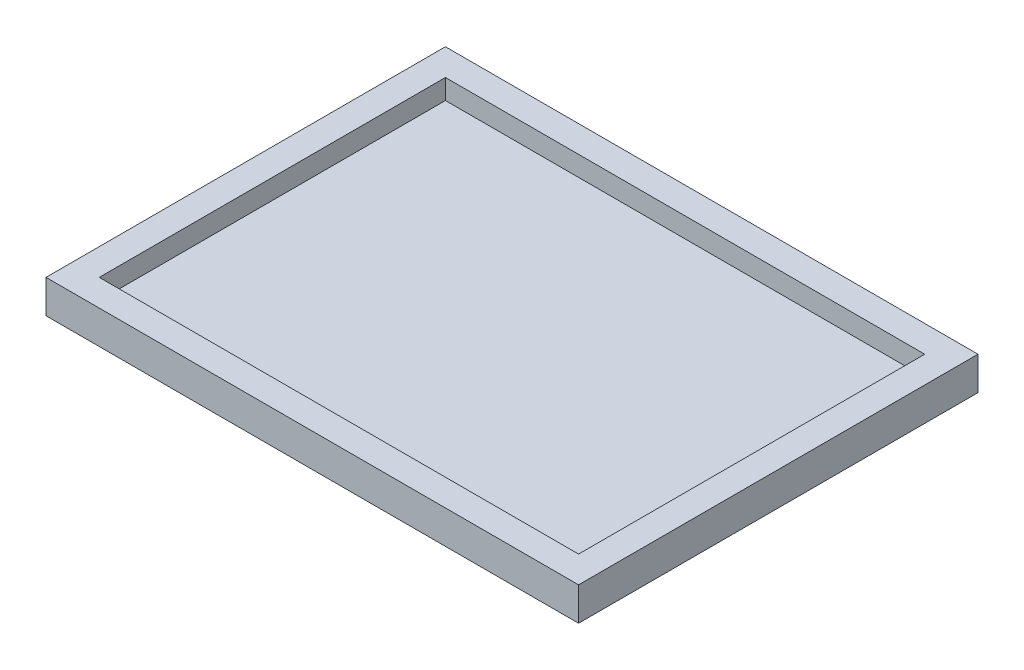
ISO-10303-21;
HEADER;
FILE_DESCRIPTION(('STEP AP214'),'2;1');
FILE_NAME('part.step','',(''),(''),'','','');
FILE_SCHEMA(('AUTOMOTIVE_DESIGN { 1 0 10303 214 1 1 1 1 }'));
ENDSEC;
DATA;
#1=APPLICATION_CONTEXT('core data for automotive mechanical design processes');
#2=APPLICATION_PROTOCOL_DEFINITION('international standard','automotive_design',2000,#1);
#3=PRODUCT_CONTEXT('',#1,'mechanical');
#4=PRODUCT('Part','Part','',(#3));
#5=PRODUCT_RELATED_PRODUCT_CATEGORY('part','',(#4));
#6=PRODUCT_DEFINITION_FORMATION('','',#4);
#7=PRODUCT_DEFINITION_CONTEXT('part definition',#1,'design');
#8=PRODUCT_DEFINITION('design','',#6,#7);
#9=PRODUCT_DEFINITION_SHAPE('','',#8);
#10=(LENGTH_UNIT() NAMED_UNIT(*) SI_UNIT(.MILLI.,.METRE.));
#11=(NAMED_UNIT(*) PLANE_ANGLE_UNIT() SI_UNIT($,.RADIAN.));
#12=(NAMED_UNIT(*) SI_UNIT($,.STERADIAN.) SOLID_ANGLE_UNIT());
#13=UNCERTAINTY_MEASURE_WITH_UNIT(LENGTH_MEASURE(1.E-05),#10,'distance_accuracy_value','');
#14=(GEOMETRIC_REPRESENTATION_CONTEXT(3) GLOBAL_UNCERTAINTY_ASSIGNED_CONTEXT((#13)) GLOBAL_UNIT_ASSIGNED_CONTEXT((#10,
#11,#12)) REPRESENTATION_CONTEXT('',''));
#15=CARTESIAN_POINT('',(0.,0.,0.));
#16=DIRECTION('',(0.,0.,1.));
#17=DIRECTION('',(1.,0.,0.));
#18=AXIS2_PLACEMENT_3D('',#15,#16,#17);
#19=CARTESIAN_POINT('',(0.,10.,0.));
#20=DIRECTION('',(1.,0.,0.));
#21=DIRECTION('',(0.,0.,-1.));
#22=AXIS2_PLACEMENT_3D('',#19,#20,#21);
#23=PLANE('',#22);
#24=DIRECTION('',(0.,0.,1.));
#25=VECTOR('',#24,1.);
#26=CARTESIAN_POINT('',(0.,0.,0.));
#27=LINE('',#26,#25);
#28=CARTESIAN_POINT('',(0.,0.,-300.));
#29=VERTEX_POINT('',#28);
#30=CARTESIAN_POINT('',(0.,0.,0.));
#31=VERTEX_POINT('',#30);
#32=EDGE_CURVE('E173',#29,#31,#27,.T.);
#33=ORIENTED_EDGE('',*,*,#32,.T.);
#34=DIRECTION('',(0.,-1.,0.));
#35=VECTOR('',#34,1.);
#36=CARTESIAN_POINT('',(0.,10.,0.));
#37=LINE('',#36,#35);
#38=CARTESIAN_POINT('',(0.,25.,0.));
#39=VERTEX_POINT('',#38);
#40=EDGE_CURVE('E11',#39,#31,#37,.T.);
#41=ORIENTED_EDGE('',*,*,#40,.F.);
#42=DIRECTION('',(0.,0.,1.));
#43=VECTOR('',#42,1.);
#44=CARTESIAN_POINT('',(0.,25.,-300.));
#45=LINE('',#44,#43);
#46=CARTESIAN_POINT('',(0.,25.,-300.));
#47=VERTEX_POINT('',#46);
#48=EDGE_CURVE('E124',#47,#39,#45,.T.);
#49=ORIENTED_EDGE('',*,*,#48,.F.);
#50=DIRECTION('',(0.,-1.,0.));
#51=VECTOR('',#50,1.);
#52=CARTESIAN_POINT('',(0.,10.,-300.));
#53=LINE('',#52,#51);
#54=EDGE_CURVE('E185',#47,#29,#53,.T.);
#55=ORIENTED_EDGE('',*,*,#54,.T.);
#56=EDGE_LOOP('',(#33,#41,#49,#55));
#57=FACE_BOUND('',#56,.T.);
#58=ADVANCED_FACE('F39',(#57),#23,.F.);
#59=CARTESIAN_POINT('',(0.,10.,0.));
#60=DIRECTION('',(0.,0.,-1.));
#61=DIRECTION('',(-1.,0.,0.));
#62=AXIS2_PLACEMENT_3D('',#59,#60,#61);
#63=PLANE('',#62);
#64=DIRECTION('',(1.,0.,0.));
#65=VECTOR('',#64,1.);
#66=CARTESIAN_POINT('',(0.,0.,0.));
#67=LINE('',#66,#65);
#68=CARTESIAN_POINT('',(400.,0.,0.));
#69=VERTEX_POINT('',#68);
#70=EDGE_CURVE('E177',#31,#69,#67,.T.);
#71=ORIENTED_EDGE('',*,*,#70,.T.);
#72=DIRECTION('',(0.,-1.,0.));
#73=VECTOR('',#72,1.);
#74=CARTESIAN_POINT('',(400.,10.,0.));
#75=LINE('',#74,#73);
#76=CARTESIAN_POINT('',(400.,25.,0.));
#77=VERTEX_POINT('',#76);
#78=EDGE_CURVE('E47',#77,#69,#75,.T.);
#79=ORIENTED_EDGE('',*,*,#78,.F.);
#80=DIRECTION('',(1.,0.,0.));
#81=VECTOR('',#80,1.);
#82=CARTESIAN_POINT('',(0.,25.,0.));
#83=LINE('',#82,#81);
#84=EDGE_CURVE('E161',#39,#77,#83,.T.);
#85=ORIENTED_EDGE('',*,*,#84,.F.);
#86=ORIENTED_EDGE('',*,*,#40,.T.);
#87=EDGE_LOOP('',(#71,#79,#85,#86));
#88=FACE_BOUND('',#87,.T.);
#89=ADVANCED_FACE('F206',(#88),#63,.F.);
#90=CARTESIAN_POINT('',(400.,10.,0.));
#91=DIRECTION('',(-1.,0.,0.));
#92=DIRECTION('',(0.,0.,1.));
#93=AXIS2_PLACEMENT_3D('',#90,#91,#92);
#94=PLANE('',#93);
#95=DIRECTION('',(0.,0.,-1.));
#96=VECTOR('',#95,1.);
#97=CARTESIAN_POINT('',(400.,0.,0.));
#98=LINE('',#97,#96);
#99=CARTESIAN_POINT('',(400.,0.,-300.));
#100=VERTEX_POINT('',#99);
#101=EDGE_CURVE('E180',#69,#100,#98,.T.);
#102=ORIENTED_EDGE('',*,*,#101,.T.);
#103=DIRECTION('',(0.,-1.,0.));
#104=VECTOR('',#103,1.);
#105=CARTESIAN_POINT('',(400.,10.,-300.));
#106=LINE('',#105,#104);
#107=CARTESIAN_POINT('',(400.,25.,-300.));
#108=VERTEX_POINT('',#107);
#109=EDGE_CURVE('E188',#108,#100,#106,.T.);
#110=ORIENTED_EDGE('',*,*,#109,.F.);
#111=DIRECTION('',(0.,0.,-1.));
#112=VECTOR('',#111,1.);
#113=CARTESIAN_POINT('',(400.,25.,-300.));
#114=LINE('',#113,#112);
#115=EDGE_CURVE('E165',#77,#108,#114,.T.);
#116=ORIENTED_EDGE('',*,*,#115,.F.);
#117=ORIENTED_EDGE('',*,*,#78,.T.);
#118=EDGE_LOOP('',(#102,#110,#116,#117));
#119=FACE_BOUND('',#118,.T.);
#120=ADVANCED_FACE('F195',(#119),#94,.F.);
#121=CARTESIAN_POINT('',(0.,10.,-300.));
#122=DIRECTION('',(0.,0.,1.));
#123=DIRECTION('',(1.,0.,0.));
#124=AXIS2_PLACEMENT_3D('',#121,#122,#123);
#125=PLANE('',#124);
#126=DIRECTION('',(-1.,0.,0.));
#127=VECTOR('',#126,1.);
#128=CARTESIAN_POINT('',(0.,0.,-300.));
#129=LINE('',#128,#127);
#130=EDGE_CURVE('E62',#100,#29,#129,.T.);
#131=ORIENTED_EDGE('',*,*,#130,.T.);
#132=ORIENTED_EDGE('',*,*,#54,.F.);
#133=DIRECTION('',(-1.,0.,0.));
#134=VECTOR('',#133,1.);
#135=CARTESIAN_POINT('',(0.,25.,-300.));
#136=LINE('',#135,#134);
#137=EDGE_CURVE('E169',#108,#47,#136,.T.);
#138=ORIENTED_EDGE('',*,*,#137,.F.);
#139=ORIENTED_EDGE('',*,*,#109,.T.);
#140=EDGE_LOOP('',(#131,#132,#138,#139));
#141=FACE_BOUND('',#140,.T.);
#142=ADVANCED_FACE('F204',(#141),#125,.F.);
#143=CARTESIAN_POINT('',(0.,0.,0.));
#144=DIRECTION('',(0.,-1.,0.));
#145=DIRECTION('',(0.,0.,-1.));
#146=AXIS2_PLACEMENT_3D('',#143,#144,#145);
#147=PLANE('',#146);
#148=ORIENTED_EDGE('',*,*,#32,.F.);
#149=ORIENTED_EDGE('',*,*,#130,.F.);
#150=ORIENTED_EDGE('',*,*,#101,.F.);
#151=ORIENTED_EDGE('',*,*,#70,.F.);
#152=EDGE_LOOP('',(#148,#149,#150,#151));
#153=FACE_BOUND('',#152,.T.);
#154=ADVANCED_FACE('F200',(#153),#147,.T.);
#155=CARTESIAN_POINT('',(0.,25.,0.));
#156=DIRECTION('',(0.,1.,0.));
#157=DIRECTION('',(0.,0.,1.));
#158=AXIS2_PLACEMENT_3D('',#155,#156,#157);
#159=PLANE('',#158);
#160=ORIENTED_EDGE('',*,*,#48,.T.);
#161=ORIENTED_EDGE('',*,*,#84,.T.);
#162=ORIENTED_EDGE('',*,*,#115,.T.);
#163=ORIENTED_EDGE('',*,*,#137,.T.);
#164=EDGE_LOOP('',(#160,#161,#162,#163));
#165=FACE_BOUND('',#164,.T.);
#166=DIRECTION('',(1.,0.,0.));
#167=VECTOR('',#166,1.);
#168=CARTESIAN_POINT('',(20.,25.,-20.));
#169=LINE('',#168,#167);
#170=CARTESIAN_POINT('',(20.,25.,-20.));
#171=VERTEX_POINT('',#170);
#172=CARTESIAN_POINT('',(380.,25.,-20.));
#173=VERTEX_POINT('',#172);
#174=EDGE_CURVE('E115',#171,#173,#169,.T.);
#175=ORIENTED_EDGE('',*,*,#174,.F.);
#176=DIRECTION('',(0.,0.,1.));
#177=VECTOR('',#176,1.);
#178=CARTESIAN_POINT('',(20.,25.,-280.));
#179=LINE('',#178,#177);
#180=CARTESIAN_POINT('',(20.,25.,-280.));
#181=VERTEX_POINT('',#180);
#182=EDGE_CURVE('E106',#181,#171,#179,.T.);
#183=ORIENTED_EDGE('',*,*,#182,.F.);
#184=DIRECTION('',(-1.,0.,0.));
#185=VECTOR('',#184,1.);
#186=CARTESIAN_POINT('',(20.,25.,-280.));
#187=LINE('',#186,#185);
#188=CARTESIAN_POINT('',(380.,25.,-280.));
#189=VERTEX_POINT('',#188);
#190=EDGE_CURVE('E134',#189,#181,#187,.T.);
#191=ORIENTED_EDGE('',*,*,#190,.F.);
#192=DIRECTION('',(0.,0.,-1.));
#193=VECTOR('',#192,1.);
#194=CARTESIAN_POINT('',(380.,25.,-280.));
#195=LINE('',#194,#193);
#196=EDGE_CURVE('E130',#173,#189,#195,.T.);
#197=ORIENTED_EDGE('',*,*,#196,.F.);
#198=EDGE_LOOP('',(#175,#183,#191,#197));
#199=FACE_BOUND('',#198,.T.);
#200=ADVANCED_FACE('F128',(#165,#199),#159,.T.);
#201=CARTESIAN_POINT('',(20.,25.,-280.));
#202=DIRECTION('',(1.,0.,0.));
#203=DIRECTION('',(0.,0.,-1.));
#204=AXIS2_PLACEMENT_3D('',#201,#202,#203);
#205=PLANE('',#204);
#206=DIRECTION('',(0.,0.,1.));
#207=VECTOR('',#206,1.);
#208=CARTESIAN_POINT('',(20.,10.,-280.));
#209=LINE('',#208,#207);
#210=CARTESIAN_POINT('',(20.,10.,-280.));
#211=VERTEX_POINT('',#210);
#212=CARTESIAN_POINT('',(20.,10.,-20.));
#213=VERTEX_POINT('',#212);
#214=EDGE_CURVE('E139',#211,#213,#209,.T.);
#215=ORIENTED_EDGE('',*,*,#214,.F.);
#216=DIRECTION('',(0.,-1.,0.));
#217=VECTOR('',#216,1.);
#218=CARTESIAN_POINT('',(20.,25.,-280.));
#219=LINE('',#218,#217);
#220=EDGE_CURVE('E54',#181,#211,#219,.T.);
#221=ORIENTED_EDGE('',*,*,#220,.F.);
#222=ORIENTED_EDGE('',*,*,#182,.T.);
#223=DIRECTION('',(0.,-1.,0.));
#224=VECTOR('',#223,1.);
#225=CARTESIAN_POINT('',(20.,25.,-20.));
#226=LINE('',#225,#224);
#227=EDGE_CURVE('E109',#171,#213,#226,.T.);
#228=ORIENTED_EDGE('',*,*,#227,.T.);
#229=EDGE_LOOP('',(#215,#221,#222,#228));
#230=FACE_BOUND('',#229,.T.);
#231=ADVANCED_FACE('F108',(#230),#205,.T.);
#232=CARTESIAN_POINT('',(20.,25.,-20.));
#233=DIRECTION('',(0.,0.,-1.));
#234=DIRECTION('',(-1.,0.,0.));
#235=AXIS2_PLACEMENT_3D('',#232,#233,#234);
#236=PLANE('',#235);
#237=DIRECTION('',(1.,0.,0.));
#238=VECTOR('',#237,1.);
#239=CARTESIAN_POINT('',(20.,10.,-20.));
#240=LINE('',#239,#238);
#241=CARTESIAN_POINT('',(380.,10.,-20.));
#242=VERTEX_POINT('',#241);
#243=EDGE_CURVE('E122',#213,#242,#240,.T.);
#244=ORIENTED_EDGE('',*,*,#243,.F.);
#245=ORIENTED_EDGE('',*,*,#227,.F.);
#246=ORIENTED_EDGE('',*,*,#174,.T.);
#247=DIRECTION('',(0.,-1.,0.));
#248=VECTOR('',#247,1.);
#249=CARTESIAN_POINT('',(380.,25.,-20.));
#250=LINE('',#249,#248);
#251=EDGE_CURVE('E125',#173,#242,#250,.T.);
#252=ORIENTED_EDGE('',*,*,#251,.T.);
#253=EDGE_LOOP('',(#244,#245,#246,#252));
#254=FACE_BOUND('',#253,.T.);
#255=ADVANCED_FACE('F119',(#254),#236,.T.);
#256=CARTESIAN_POINT('',(380.,25.,-280.));
#257=DIRECTION('',(-1.,0.,0.));
#258=DIRECTION('',(0.,0.,1.));
#259=AXIS2_PLACEMENT_3D('',#256,#257,#258);
#260=PLANE('',#259);
#261=DIRECTION('',(0.,0.,-1.));
#262=VECTOR('',#261,1.);
#263=CARTESIAN_POINT('',(380.,10.,-280.));
#264=LINE('',#263,#262);
#265=CARTESIAN_POINT('',(380.,10.,-280.));
#266=VERTEX_POINT('',#265);
#267=EDGE_CURVE('E144',#242,#266,#264,.T.);
#268=ORIENTED_EDGE('',*,*,#267,.F.);
#269=ORIENTED_EDGE('',*,*,#251,.F.);
#270=ORIENTED_EDGE('',*,*,#196,.T.);
#271=DIRECTION('',(0.,-1.,0.));
#272=VECTOR('',#271,1.);
#273=CARTESIAN_POINT('',(380.,25.,-280.));
#274=LINE('',#273,#272);
#275=EDGE_CURVE('E153',#189,#266,#274,.T.);
#276=ORIENTED_EDGE('',*,*,#275,.T.);
#277=EDGE_LOOP('',(#268,#269,#270,#276));
#278=FACE_BOUND('',#277,.T.);
#279=ADVANCED_FACE('F229',(#278),#260,.T.);
#280=CARTESIAN_POINT('',(20.,25.,-280.));
#281=DIRECTION('',(0.,0.,1.));
#282=DIRECTION('',(1.,0.,0.));
#283=AXIS2_PLACEMENT_3D('',#280,#281,#282);
#284=PLANE('',#283);
#285=DIRECTION('',(-1.,0.,0.));
#286=VECTOR('',#285,1.);
#287=CARTESIAN_POINT('',(20.,10.,-280.));
#288=LINE('',#287,#286);
#289=EDGE_CURVE('E116',#266,#211,#288,.T.);
#290=ORIENTED_EDGE('',*,*,#289,.F.);
#291=ORIENTED_EDGE('',*,*,#275,.F.);
#292=ORIENTED_EDGE('',*,*,#190,.T.);
#293=ORIENTED_EDGE('',*,*,#220,.T.);
#294=EDGE_LOOP('',(#290,#291,#292,#293));
#295=FACE_BOUND('',#294,.T.);
#296=ADVANCED_FACE('F221',(#295),#284,.T.);
#297=CARTESIAN_POINT('',(0.,10.,0.));
#298=DIRECTION('',(0.,-1.,0.));
#299=DIRECTION('',(0.,0.,-1.));
#300=AXIS2_PLACEMENT_3D('',#297,#298,#299);
#301=PLANE('',#300);
#302=ORIENTED_EDGE('',*,*,#289,.T.);
#303=ORIENTED_EDGE('',*,*,#214,.T.);
#304=ORIENTED_EDGE('',*,*,#243,.T.);
#305=ORIENTED_EDGE('',*,*,#267,.T.);
#306=EDGE_LOOP('',(#302,#303,#304,#305));
#307=FACE_BOUND('',#306,.T.);
#308=ADVANCED_FACE('F218',(#307),#301,.F.);
#309=CLOSED_SHELL('',(#58,#89,#120,#142,#154,#200,#231,#255,#279,#296,#308));
#310=MANIFOLD_SOLID_BREP('B2',#309);
#311=ADVANCED_BREP_SHAPE_REPRESENTATION('',(#18,#310),#14);
#312=SHAPE_DEFINITION_REPRESENTATION(#9,#311);
ENDSEC;
END-ISO-10303-21;
